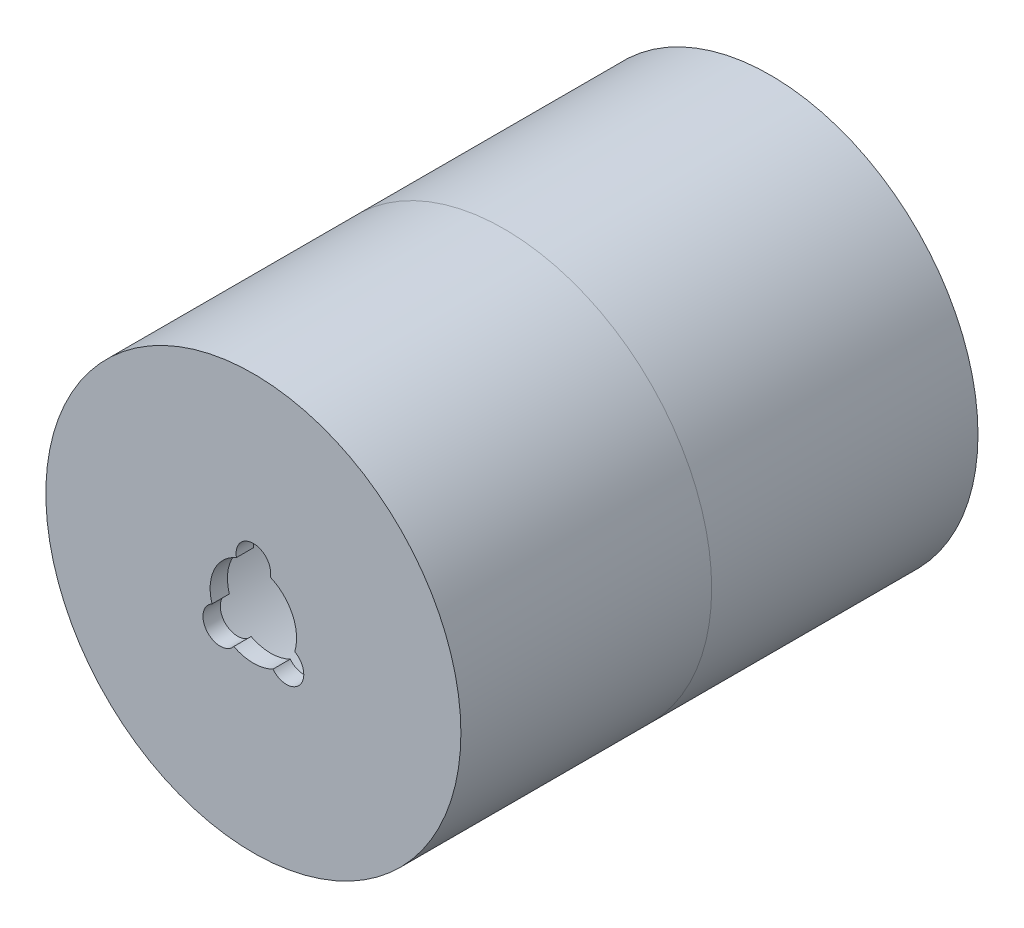
ISO-10303-21;
HEADER;
FILE_DESCRIPTION(('STEP AP214'),'2;1');
FILE_NAME('part.step','',(''),(''),'','','');
FILE_SCHEMA(('AUTOMOTIVE_DESIGN { 1 0 10303 214 1 1 1 1 }'));
ENDSEC;
DATA;
#1=APPLICATION_CONTEXT('core data for automotive mechanical design processes');
#2=APPLICATION_PROTOCOL_DEFINITION('international standard','automotive_design',2000,#1);
#3=PRODUCT_CONTEXT('',#1,'mechanical');
#4=PRODUCT('Part','Part','',(#3));
#5=PRODUCT_RELATED_PRODUCT_CATEGORY('part','',(#4));
#6=PRODUCT_DEFINITION_FORMATION('','',#4);
#7=PRODUCT_DEFINITION_CONTEXT('part definition',#1,'design');
#8=PRODUCT_DEFINITION('design','',#6,#7);
#9=PRODUCT_DEFINITION_SHAPE('','',#8);
#10=(LENGTH_UNIT() NAMED_UNIT(*) SI_UNIT(.MILLI.,.METRE.));
#11=(NAMED_UNIT(*) PLANE_ANGLE_UNIT() SI_UNIT($,.RADIAN.));
#12=(NAMED_UNIT(*) SI_UNIT($,.STERADIAN.) SOLID_ANGLE_UNIT());
#13=UNCERTAINTY_MEASURE_WITH_UNIT(LENGTH_MEASURE(1.E-05),#10,'distance_accuracy_value','');
#14=(GEOMETRIC_REPRESENTATION_CONTEXT(3) GLOBAL_UNCERTAINTY_ASSIGNED_CONTEXT((#13)) GLOBAL_UNIT_ASSIGNED_CONTEXT((#10,
#11,#12)) REPRESENTATION_CONTEXT('',''));
#15=CARTESIAN_POINT('',(0.,0.,0.));
#16=DIRECTION('',(0.,0.,1.));
#17=DIRECTION('',(1.,0.,0.));
#18=AXIS2_PLACEMENT_3D('',#15,#16,#17);
#19=CARTESIAN_POINT('',(0.,0.,30.8));
#20=DIRECTION('',(0.,0.,1.));
#21=DIRECTION('',(1.,0.,0.));
#22=AXIS2_PLACEMENT_3D('',#19,#20,#21);
#23=PLANE('',#22);
#24=CARTESIAN_POINT('',(0.,0.,30.8));
#25=DIRECTION('',(0.,0.,1.));
#26=DIRECTION('',(1.,0.,0.));
#27=AXIS2_PLACEMENT_3D('',#24,#25,#26);
#28=CIRCLE('',#27,22.2);
#29=CARTESIAN_POINT('',(22.2,0.,30.8));
#30=VERTEX_POINT('',#29);
#31=EDGE_CURVE('E229',#30,#30,#28,.F.);
#32=ORIENTED_EDGE('',*,*,#31,.T.);
#33=EDGE_LOOP('',(#32));
#34=FACE_BOUND('',#33,.T.);
#35=CARTESIAN_POINT('',(0.,0.,30.7999999999999));
#36=DIRECTION('',(0.,0.,1.));
#37=DIRECTION('',(1.,0.,0.));
#38=AXIS2_PLACEMENT_3D('',#35,#36,#37);
#39=CIRCLE('',#38,24.);
#40=CARTESIAN_POINT('',(24.,0.,30.7999999999999));
#41=VERTEX_POINT('',#40);
#42=EDGE_CURVE('E233',#41,#41,#39,.F.);
#43=ORIENTED_EDGE('',*,*,#42,.F.);
#44=EDGE_LOOP('',(#43));
#45=FACE_BOUND('',#44,.T.);
#46=ADVANCED_FACE('F93',(#34,#45),#23,.T.);
#47=CARTESIAN_POINT('',(0.,0.,1072.38147752167));
#48=DIRECTION('',(0.,0.,1.));
#49=DIRECTION('',(1.,0.,0.));
#50=AXIS2_PLACEMENT_3D('',#47,#48,#49);
#51=CYLINDRICAL_SURFACE('',#50,24.);
#52=CARTESIAN_POINT('',(0.,0.,0.));
#53=DIRECTION('',(0.,0.,1.));
#54=DIRECTION('',(1.,0.,0.));
#55=AXIS2_PLACEMENT_3D('',#52,#53,#54);
#56=CIRCLE('',#55,24.);
#57=CARTESIAN_POINT('',(24.,0.,0.));
#58=VERTEX_POINT('',#57);
#59=EDGE_CURVE('E237',#58,#58,#56,.T.);
#60=ORIENTED_EDGE('',*,*,#59,.T.);
#61=EDGE_LOOP('',(#60));
#62=FACE_BOUND('',#61,.T.);
#63=ORIENTED_EDGE('',*,*,#42,.T.);
#64=EDGE_LOOP('',(#63));
#65=FACE_BOUND('',#64,.T.);
#66=ADVANCED_FACE('F95',(#62,#65),#51,.T.);
#67=CARTESIAN_POINT('',(0.,0.,28.8));
#68=DIRECTION('',(0.,0.,1.));
#69=DIRECTION('',(1.,0.,0.));
#70=AXIS2_PLACEMENT_3D('',#67,#68,#69);
#71=CYLINDRICAL_SURFACE('',#70,22.2);
#72=CARTESIAN_POINT('',(0.,0.,29.8));
#73=DIRECTION('',(0.,0.,1.));
#74=DIRECTION('',(1.,0.,0.));
#75=AXIS2_PLACEMENT_3D('',#72,#73,#74);
#76=CIRCLE('',#75,22.2);
#77=CARTESIAN_POINT('',(-7.5928471818306,20.8611761814471,29.8));
#78=VERTEX_POINT('',#77);
#79=CARTESIAN_POINT('',(7.59284718183028,20.8611761814471,29.8));
#80=VERTEX_POINT('',#79);
#81=EDGE_CURVE('E103',#78,#80,#76,.T.);
#82=ORIENTED_EDGE('',*,*,#81,.F.);
#83=DIRECTION('',(0.,0.,1.));
#84=VECTOR('',#83,1.);
#85=CARTESIAN_POINT('',(-7.5928471818306,20.8611761814471,28.8));
#86=LINE('',#85,#84);
#87=CARTESIAN_POINT('',(-7.5928471818306,20.8611761814471,28.8));
#88=VERTEX_POINT('',#87);
#89=EDGE_CURVE('E216',#88,#78,#86,.T.);
#90=ORIENTED_EDGE('',*,*,#89,.F.);
#91=CARTESIAN_POINT('',(0.,0.,28.8));
#92=DIRECTION('',(0.,0.,1.));
#93=DIRECTION('',(1.,0.,0.));
#94=AXIS2_PLACEMENT_3D('',#91,#92,#93);
#95=CIRCLE('',#94,22.2);
#96=CARTESIAN_POINT('',(7.59284718183028,20.8611761814471,28.8));
#97=VERTEX_POINT('',#96);
#98=EDGE_CURVE('E338',#97,#88,#95,.T.);
#99=ORIENTED_EDGE('',*,*,#98,.F.);
#100=DIRECTION('',(0.,0.,1.));
#101=VECTOR('',#100,1.);
#102=CARTESIAN_POINT('',(7.59284718183028,20.8611761814471,28.8));
#103=LINE('',#102,#101);
#104=EDGE_CURVE('E213',#97,#80,#103,.T.);
#105=ORIENTED_EDGE('',*,*,#104,.T.);
#106=EDGE_LOOP('',(#82,#90,#99,#105));
#107=FACE_BOUND('',#106,.T.);
#108=ORIENTED_EDGE('',*,*,#31,.F.);
#109=EDGE_LOOP('',(#108));
#110=FACE_BOUND('',#109,.T.);
#111=ADVANCED_FACE('F273',(#107,#110),#71,.F.);
#112=CARTESIAN_POINT('',(0.,0.,1072.38147752167));
#113=DIRECTION('',(0.,0.,1.));
#114=DIRECTION('',(1.,0.,0.));
#115=AXIS2_PLACEMENT_3D('',#112,#113,#114);
#116=CYLINDRICAL_SURFACE('',#115,17.);
#117=CARTESIAN_POINT('',(0.,0.,1.80000000000002));
#118=DIRECTION('',(0.,0.,1.));
#119=DIRECTION('',(1.,0.,0.));
#120=AXIS2_PLACEMENT_3D('',#117,#118,#119);
#121=CIRCLE('',#120,17.);
#122=CARTESIAN_POINT('',(17.,0.,1.80000000000002));
#123=VERTEX_POINT('',#122);
#124=EDGE_CURVE('E328',#123,#123,#121,.T.);
#125=ORIENTED_EDGE('',*,*,#124,.F.);
#126=EDGE_LOOP('',(#125));
#127=FACE_BOUND('',#126,.T.);
#128=CARTESIAN_POINT('',(0.,0.,29.8));
#129=DIRECTION('',(0.,0.,1.));
#130=DIRECTION('',(1.,0.,0.));
#131=AXIS2_PLACEMENT_3D('',#128,#129,#130);
#132=CIRCLE('',#131,17.);
#133=CARTESIAN_POINT('',(-4.68397596917369,16.3419817990415,29.8));
#134=VERTEX_POINT('',#133);
#135=CARTESIAN_POINT('',(4.68397596917369,16.3419817990415,29.8));
#136=VERTEX_POINT('',#135);
#137=EDGE_CURVE('E245',#134,#136,#132,.F.);
#138=ORIENTED_EDGE('',*,*,#137,.F.);
#139=DIRECTION('',(0.,0.,1.));
#140=VECTOR('',#139,1.);
#141=CARTESIAN_POINT('',(-4.68397596917369,16.3419817990415,28.8));
#142=LINE('',#141,#140);
#143=CARTESIAN_POINT('',(-4.68397596917369,16.3419817990415,28.8));
#144=VERTEX_POINT('',#143);
#145=EDGE_CURVE('E205',#144,#134,#142,.T.);
#146=ORIENTED_EDGE('',*,*,#145,.F.);
#147=CARTESIAN_POINT('',(0.,0.,28.8));
#148=DIRECTION('',(0.,0.,1.));
#149=DIRECTION('',(1.,0.,0.));
#150=AXIS2_PLACEMENT_3D('',#147,#148,#149);
#151=CIRCLE('',#150,17.);
#152=CARTESIAN_POINT('',(4.68397596917369,16.3419817990415,28.8));
#153=VERTEX_POINT('',#152);
#154=EDGE_CURVE('E349',#144,#153,#151,.T.);
#155=ORIENTED_EDGE('',*,*,#154,.T.);
#156=DIRECTION('',(0.,0.,1.));
#157=VECTOR('',#156,1.);
#158=CARTESIAN_POINT('',(4.68397596917369,16.3419817990415,28.8));
#159=LINE('',#158,#157);
#160=EDGE_CURVE('E199',#153,#136,#159,.T.);
#161=ORIENTED_EDGE('',*,*,#160,.T.);
#162=EDGE_LOOP('',(#138,#146,#155,#161));
#163=FACE_BOUND('',#162,.T.);
#164=ADVANCED_FACE('F269',(#127,#163),#116,.F.);
#165=CARTESIAN_POINT('',(0.,0.,28.8));
#166=DIRECTION('',(0.939692620785902,-0.342020143325687,0.));
#167=DIRECTION('',(0.342020143325687,0.939692620785902,0.));
#168=AXIS2_PLACEMENT_3D('',#165,#166,#167);
#169=PLANE('',#168);
#170=DIRECTION('',(0.342020143325687,0.939692620785902,0.));
#171=VECTOR('',#170,1.);
#172=CARTESIAN_POINT('',(0.,0.,29.8));
#173=LINE('',#172,#171);
#174=CARTESIAN_POINT('',(6.56678675185322,18.0420983190894,29.8));
#175=VERTEX_POINT('',#174);
#176=EDGE_CURVE('E381',#175,#80,#173,.T.);
#177=ORIENTED_EDGE('',*,*,#176,.T.);
#178=ORIENTED_EDGE('',*,*,#104,.F.);
#179=DIRECTION('',(0.342020143325687,0.939692620785902,0.));
#180=VECTOR('',#179,1.);
#181=CARTESIAN_POINT('',(0.,0.,28.8));
#182=LINE('',#181,#180);
#183=CARTESIAN_POINT('',(6.56678675185322,18.0420983190894,28.8));
#184=VERTEX_POINT('',#183);
#185=EDGE_CURVE('E342',#184,#97,#182,.T.);
#186=ORIENTED_EDGE('',*,*,#185,.F.);
#187=DIRECTION('',(0.,0.,1.));
#188=VECTOR('',#187,1.);
#189=CARTESIAN_POINT('',(6.56678675185322,18.0420983190894,28.8));
#190=LINE('',#189,#188);
#191=EDGE_CURVE('E224',#184,#175,#190,.T.);
#192=ORIENTED_EDGE('',*,*,#191,.T.);
#193=EDGE_LOOP('',(#177,#178,#186,#192));
#194=FACE_BOUND('',#193,.T.);
#195=ADVANCED_FACE('F265',(#194),#169,.F.);
#196=CARTESIAN_POINT('',(0.,0.,28.8));
#197=DIRECTION('',(0.,0.,1.));
#198=DIRECTION('',(1.,0.,0.));
#199=AXIS2_PLACEMENT_3D('',#196,#197,#198);
#200=CYLINDRICAL_SURFACE('',#199,19.2);
#201=DIRECTION('',(0.,0.,1.));
#202=VECTOR('',#201,1.);
#203=CARTESIAN_POINT('',(-6.56678675185351,18.0420983190894,28.8));
#204=LINE('',#203,#202);
#205=CARTESIAN_POINT('',(-6.56678675185351,18.0420983190894,28.8));
#206=VERTEX_POINT('',#205);
#207=CARTESIAN_POINT('',(-6.56678675185351,18.0420983190894,29.8));
#208=VERTEX_POINT('',#207);
#209=EDGE_CURVE('E220',#206,#208,#204,.T.);
#210=ORIENTED_EDGE('',*,*,#209,.T.);
#211=CARTESIAN_POINT('',(0.,0.,29.8));
#212=DIRECTION('',(0.,0.,1.));
#213=DIRECTION('',(1.,0.,0.));
#214=AXIS2_PLACEMENT_3D('',#211,#212,#213);
#215=CIRCLE('',#214,19.2);
#216=EDGE_CURVE('E378',#175,#208,#215,.F.);
#217=ORIENTED_EDGE('',*,*,#216,.F.);
#218=ORIENTED_EDGE('',*,*,#191,.F.);
#219=CARTESIAN_POINT('',(0.,0.,28.8));
#220=DIRECTION('',(0.,0.,1.));
#221=DIRECTION('',(1.,0.,0.));
#222=AXIS2_PLACEMENT_3D('',#219,#220,#221);
#223=CIRCLE('',#222,19.2);
#224=EDGE_CURVE('E198',#184,#206,#223,.F.);
#225=ORIENTED_EDGE('',*,*,#224,.T.);
#226=EDGE_LOOP('',(#210,#217,#218,#225));
#227=FACE_BOUND('',#226,.T.);
#228=ADVANCED_FACE('F262',(#227),#200,.F.);
#229=CARTESIAN_POINT('',(0.,0.,28.8));
#230=DIRECTION('',(0.939692620785897,0.342020143325699,0.));
#231=DIRECTION('',(-0.342020143325699,0.939692620785897,0.));
#232=AXIS2_PLACEMENT_3D('',#229,#230,#231);
#233=PLANE('',#232);
#234=ORIENTED_EDGE('',*,*,#89,.T.);
#235=DIRECTION('',(-0.342020143325699,0.939692620785897,0.));
#236=VECTOR('',#235,1.);
#237=CARTESIAN_POINT('',(0.,0.,29.8));
#238=LINE('',#237,#236);
#239=EDGE_CURVE('E13',#208,#78,#238,.T.);
#240=ORIENTED_EDGE('',*,*,#239,.F.);
#241=ORIENTED_EDGE('',*,*,#209,.F.);
#242=DIRECTION('',(-0.342020143325699,0.939692620785897,0.));
#243=VECTOR('',#242,1.);
#244=CARTESIAN_POINT('',(0.,0.,28.8));
#245=LINE('',#244,#243);
#246=EDGE_CURVE('E335',#206,#88,#245,.T.);
#247=ORIENTED_EDGE('',*,*,#246,.T.);
#248=EDGE_LOOP('',(#234,#240,#241,#247));
#249=FACE_BOUND('',#248,.T.);
#250=ADVANCED_FACE('F259',(#249),#233,.T.);
#251=CARTESIAN_POINT('',(-1.,19.9722249756745,28.8));
#252=CARTESIAN_POINT('',(-1.83751743884076,19.9722249756745,28.8));
#253=CARTESIAN_POINT('',(-3.40068888477795,17.6065514435698,28.8));
#254=CARTESIAN_POINT('',(-4.50526886810057,16.5180823598799,28.8));
#255=B_SPLINE_CURVE_WITH_KNOTS('',3,(#251,#252,#253,#254),.UNSPECIFIED.,.F.,.F.,(4,4),(0.,1.),.UNSPECIFIED.);
#256=DIRECTION('',(0.,0.,1.));
#257=VECTOR('',#256,1.);
#258=SURFACE_OF_LINEAR_EXTRUSION('',#255,#257);
#259=DIRECTION('',(0.,0.,1.));
#260=VECTOR('',#259,1.);
#261=CARTESIAN_POINT('',(-4.50526886810057,16.5180823598799,28.8));
#262=LINE('',#261,#260);
#263=CARTESIAN_POINT('',(-4.50526886810057,16.5180823598799,28.8));
#264=VERTEX_POINT('',#263);
#265=CARTESIAN_POINT('',(-4.50526886810057,16.5180823598799,29.8));
#266=VERTEX_POINT('',#265);
#267=EDGE_CURVE('E209',#264,#266,#262,.T.);
#268=ORIENTED_EDGE('',*,*,#267,.T.);
#269=CARTESIAN_POINT('',(-1.,19.9722249756745,29.8));
#270=CARTESIAN_POINT('',(-1.83751743884076,19.9722249756745,29.8));
#271=CARTESIAN_POINT('',(-3.40068888477795,17.6065514435698,29.8));
#272=CARTESIAN_POINT('',(-4.50526886810057,16.5180823598799,29.8));
#273=B_SPLINE_CURVE_WITH_KNOTS('',3,(#269,#270,#271,#272),.UNSPECIFIED.,.F.,.F.,(4,4),(0.,1.),.UNSPECIFIED.);
#274=CARTESIAN_POINT('',(-1.,19.9722249756745,29.8));
#275=VERTEX_POINT('',#274);
#276=EDGE_CURVE('E188',#275,#266,#273,.T.);
#277=ORIENTED_EDGE('',*,*,#276,.F.);
#278=DIRECTION('',(0.,0.,1.));
#279=VECTOR('',#278,1.);
#280=CARTESIAN_POINT('',(-1.,19.9722249756745,28.8));
#281=LINE('',#280,#279);
#282=CARTESIAN_POINT('',(-1.,19.9722249756745,28.8));
#283=VERTEX_POINT('',#282);
#284=EDGE_CURVE('E97',#283,#275,#281,.T.);
#285=ORIENTED_EDGE('',*,*,#284,.F.);
#286=EDGE_CURVE('E238',#283,#264,#255,.T.);
#287=ORIENTED_EDGE('',*,*,#286,.T.);
#288=EDGE_LOOP('',(#268,#277,#285,#287));
#289=FACE_BOUND('',#288,.T.);
#290=ADVANCED_FACE('F254',(#289),#258,.T.);
#291=CARTESIAN_POINT('',(-10.4776887180417,10.6327735007392,28.8));
#292=DIRECTION('',(-0.701893189425482,0.712282212776737,0.));
#293=DIRECTION('',(-0.712282212776737,-0.701893189425482,0.));
#294=AXIS2_PLACEMENT_3D('',#291,#292,#293);
#295=PLANE('',#294);
#296=ORIENTED_EDGE('',*,*,#145,.T.);
#297=DIRECTION('',(-0.712282212776737,-0.701893189425482,0.));
#298=VECTOR('',#297,1.);
#299=CARTESIAN_POINT('',(-10.4776887180417,10.6327735007392,29.8));
#300=LINE('',#299,#298);
#301=EDGE_CURVE('E361',#266,#134,#300,.T.);
#302=ORIENTED_EDGE('',*,*,#301,.F.);
#303=ORIENTED_EDGE('',*,*,#267,.F.);
#304=DIRECTION('',(-0.712282212776737,-0.701893189425482,0.));
#305=VECTOR('',#304,1.);
#306=CARTESIAN_POINT('',(-10.4776887180417,10.6327735007392,28.8));
#307=LINE('',#306,#305);
#308=EDGE_CURVE('E346',#264,#144,#307,.T.);
#309=ORIENTED_EDGE('',*,*,#308,.T.);
#310=EDGE_LOOP('',(#296,#302,#303,#309));
#311=FACE_BOUND('',#310,.T.);
#312=ADVANCED_FACE('F258',(#311),#295,.T.);
#313=CARTESIAN_POINT('',(10.4776887180417,10.6327735007392,28.8));
#314=DIRECTION('',(-0.701893189425482,-0.712282212776737,0.));
#315=DIRECTION('',(0.712282212776737,-0.701893189425482,0.));
#316=AXIS2_PLACEMENT_3D('',#313,#314,#315);
#317=PLANE('',#316);
#318=DIRECTION('',(0.712282212776737,-0.701893189425482,0.));
#319=VECTOR('',#318,1.);
#320=CARTESIAN_POINT('',(10.4776887180417,10.6327735007392,29.8));
#321=LINE('',#320,#319);
#322=CARTESIAN_POINT('',(4.50526886810057,16.5180823598799,29.8));
#323=VERTEX_POINT('',#322);
#324=EDGE_CURVE('E175',#323,#136,#321,.T.);
#325=ORIENTED_EDGE('',*,*,#324,.T.);
#326=ORIENTED_EDGE('',*,*,#160,.F.);
#327=DIRECTION('',(0.712282212776737,-0.701893189425482,0.));
#328=VECTOR('',#327,1.);
#329=CARTESIAN_POINT('',(10.4776887180417,10.6327735007392,28.8));
#330=LINE('',#329,#328);
#331=CARTESIAN_POINT('',(4.50526886810057,16.5180823598799,28.8));
#332=VERTEX_POINT('',#331);
#333=EDGE_CURVE('E353',#332,#153,#330,.T.);
#334=ORIENTED_EDGE('',*,*,#333,.F.);
#335=DIRECTION('',(0.,0.,1.));
#336=VECTOR('',#335,1.);
#337=CARTESIAN_POINT('',(4.50526886810057,16.5180823598799,28.8));
#338=LINE('',#337,#336);
#339=EDGE_CURVE('E195',#332,#323,#338,.T.);
#340=ORIENTED_EDGE('',*,*,#339,.T.);
#341=EDGE_LOOP('',(#325,#326,#334,#340));
#342=FACE_BOUND('',#341,.T.);
#343=ADVANCED_FACE('F397',(#342),#317,.F.);
#344=CARTESIAN_POINT('',(1.,19.9722249756745,28.8));
#345=CARTESIAN_POINT('',(1.83751743884076,19.9722249756745,28.8));
#346=CARTESIAN_POINT('',(3.40068888477795,17.6065514435698,28.8));
#347=CARTESIAN_POINT('',(4.50526886810057,16.5180823598799,28.8));
#348=B_SPLINE_CURVE_WITH_KNOTS('',3,(#344,#345,#346,#347),.UNSPECIFIED.,.F.,.F.,(4,4),(0.,1.),.UNSPECIFIED.);
#349=DIRECTION('',(0.,0.,1.));
#350=VECTOR('',#349,1.);
#351=SURFACE_OF_LINEAR_EXTRUSION('',#348,#350);
#352=CARTESIAN_POINT('',(1.,19.9722249756745,29.8));
#353=CARTESIAN_POINT('',(1.83751743884076,19.9722249756745,29.8));
#354=CARTESIAN_POINT('',(3.40068888477795,17.6065514435698,29.8));
#355=CARTESIAN_POINT('',(4.50526886810057,16.5180823598799,29.8));
#356=B_SPLINE_CURVE_WITH_KNOTS('',3,(#352,#353,#354,#355),.UNSPECIFIED.,.F.,.F.,(4,4),(0.,1.),.UNSPECIFIED.);
#357=CARTESIAN_POINT('',(1.,19.9722249756745,29.8));
#358=VERTEX_POINT('',#357);
#359=EDGE_CURVE('E169',#358,#323,#356,.T.);
#360=ORIENTED_EDGE('',*,*,#359,.T.);
#361=ORIENTED_EDGE('',*,*,#339,.F.);
#362=CARTESIAN_POINT('',(1.,19.9722249756745,28.8));
#363=VERTEX_POINT('',#362);
#364=EDGE_CURVE('E192',#363,#332,#348,.T.);
#365=ORIENTED_EDGE('',*,*,#364,.F.);
#366=DIRECTION('',(0.,0.,1.));
#367=VECTOR('',#366,1.);
#368=CARTESIAN_POINT('',(1.,19.9722249756745,28.8));
#369=LINE('',#368,#367);
#370=EDGE_CURVE('E185',#363,#358,#369,.T.);
#371=ORIENTED_EDGE('',*,*,#370,.T.);
#372=EDGE_LOOP('',(#360,#361,#365,#371));
#373=FACE_BOUND('',#372,.T.);
#374=ADVANCED_FACE('F190',(#373),#351,.F.);
#375=CARTESIAN_POINT('',(0.,19.9722249756745,28.8));
#376=DIRECTION('',(0.,-1.,0.));
#377=DIRECTION('',(0.,0.,-1.));
#378=AXIS2_PLACEMENT_3D('',#375,#376,#377);
#379=PLANE('',#378);
#380=DIRECTION('',(1.,0.,0.));
#381=VECTOR('',#380,1.);
#382=CARTESIAN_POINT('',(0.,19.9722249756745,29.8));
#383=LINE('',#382,#381);
#384=EDGE_CURVE('E172',#275,#358,#383,.T.);
#385=ORIENTED_EDGE('',*,*,#384,.T.);
#386=ORIENTED_EDGE('',*,*,#370,.F.);
#387=DIRECTION('',(1.,0.,0.));
#388=VECTOR('',#387,1.);
#389=CARTESIAN_POINT('',(0.,19.9722249756745,28.8));
#390=LINE('',#389,#388);
#391=EDGE_CURVE('E246',#283,#363,#390,.T.);
#392=ORIENTED_EDGE('',*,*,#391,.F.);
#393=ORIENTED_EDGE('',*,*,#284,.T.);
#394=EDGE_LOOP('',(#385,#386,#392,#393));
#395=FACE_BOUND('',#394,.T.);
#396=ADVANCED_FACE('F183',(#395),#379,.F.);
#397=CARTESIAN_POINT('',(0.,0.,0.));
#398=DIRECTION('',(0.,0.,1.));
#399=DIRECTION('',(1.,0.,0.));
#400=AXIS2_PLACEMENT_3D('',#397,#398,#399);
#401=PLANE('',#400);
#402=ORIENTED_EDGE('',*,*,#59,.F.);
#403=EDGE_LOOP('',(#402));
#404=FACE_BOUND('',#403,.T.);
#405=CARTESIAN_POINT('',(0.,0.,0.));
#406=DIRECTION('',(0.,0.,1.));
#407=DIRECTION('',(1.,0.,0.));
#408=AXIS2_PLACEMENT_3D('',#405,#406,#407);
#409=CIRCLE('',#408,13.);
#410=CARTESIAN_POINT('',(13.,0.,0.));
#411=VERTEX_POINT('',#410);
#412=EDGE_CURVE('E228',#411,#411,#409,.T.);
#413=ORIENTED_EDGE('',*,*,#412,.T.);
#414=EDGE_LOOP('',(#413));
#415=FACE_BOUND('',#414,.T.);
#416=ADVANCED_FACE('F311',(#404,#415),#401,.F.);
#417=CARTESIAN_POINT('',(0.,0.,1.8));
#418=DIRECTION('',(0.,0.,1.));
#419=DIRECTION('',(1.,0.,0.));
#420=AXIS2_PLACEMENT_3D('',#417,#418,#419);
#421=PLANE('',#420);
#422=ORIENTED_EDGE('',*,*,#124,.T.);
#423=EDGE_LOOP('',(#422));
#424=FACE_BOUND('',#423,.T.);
#425=CARTESIAN_POINT('',(0.,0.,1.80000000000002));
#426=DIRECTION('',(0.,0.,1.));
#427=DIRECTION('',(1.,0.,0.));
#428=AXIS2_PLACEMENT_3D('',#425,#426,#427);
#429=CIRCLE('',#428,13.);
#430=CARTESIAN_POINT('',(13.,0.,1.80000000000002));
#431=VERTEX_POINT('',#430);
#432=EDGE_CURVE('E324',#431,#431,#429,.T.);
#433=ORIENTED_EDGE('',*,*,#432,.F.);
#434=EDGE_LOOP('',(#433));
#435=FACE_BOUND('',#434,.T.);
#436=ADVANCED_FACE('F307',(#424,#435),#421,.T.);
#437=CARTESIAN_POINT('',(0.,0.,1072.38147752167));
#438=DIRECTION('',(0.,0.,1.));
#439=DIRECTION('',(1.,0.,0.));
#440=AXIS2_PLACEMENT_3D('',#437,#438,#439);
#441=CYLINDRICAL_SURFACE('',#440,13.);
#442=ORIENTED_EDGE('',*,*,#412,.F.);
#443=EDGE_LOOP('',(#442));
#444=FACE_BOUND('',#443,.T.);
#445=ORIENTED_EDGE('',*,*,#432,.T.);
#446=EDGE_LOOP('',(#445));
#447=FACE_BOUND('',#446,.T.);
#448=ADVANCED_FACE('F303',(#444,#447),#441,.F.);
#449=CARTESIAN_POINT('',(0.,0.,28.8));
#450=DIRECTION('',(0.,0.,1.));
#451=DIRECTION('',(1.,0.,0.));
#452=AXIS2_PLACEMENT_3D('',#449,#450,#451);
#453=PLANE('',#452);
#454=ORIENTED_EDGE('',*,*,#286,.F.);
#455=ORIENTED_EDGE('',*,*,#391,.T.);
#456=ORIENTED_EDGE('',*,*,#364,.T.);
#457=ORIENTED_EDGE('',*,*,#333,.T.);
#458=ORIENTED_EDGE('',*,*,#154,.F.);
#459=ORIENTED_EDGE('',*,*,#308,.F.);
#460=EDGE_LOOP('',(#454,#455,#456,#457,#458,#459));
#461=FACE_BOUND('',#460,.T.);
#462=ORIENTED_EDGE('',*,*,#185,.T.);
#463=ORIENTED_EDGE('',*,*,#98,.T.);
#464=ORIENTED_EDGE('',*,*,#246,.F.);
#465=ORIENTED_EDGE('',*,*,#224,.F.);
#466=EDGE_LOOP('',(#462,#463,#464,#465));
#467=FACE_BOUND('',#466,.T.);
#468=ADVANCED_FACE('F299',(#461,#467),#453,.T.);
#469=CARTESIAN_POINT('',(0.,0.,29.8));
#470=DIRECTION('',(0.,0.,1.));
#471=DIRECTION('',(1.,0.,0.));
#472=AXIS2_PLACEMENT_3D('',#469,#470,#471);
#473=PLANE('',#472);
#474=ORIENTED_EDGE('',*,*,#239,.T.);
#475=ORIENTED_EDGE('',*,*,#81,.T.);
#476=ORIENTED_EDGE('',*,*,#176,.F.);
#477=ORIENTED_EDGE('',*,*,#216,.T.);
#478=EDGE_LOOP('',(#474,#475,#476,#477));
#479=FACE_BOUND('',#478,.T.);
#480=ADVANCED_FACE('F294',(#479),#473,.T.);
#481=CARTESIAN_POINT('',(0.,0.,29.8));
#482=DIRECTION('',(0.,0.,1.));
#483=DIRECTION('',(1.,0.,0.));
#484=AXIS2_PLACEMENT_3D('',#481,#482,#483);
#485=PLANE('',#484);
#486=ORIENTED_EDGE('',*,*,#137,.T.);
#487=ORIENTED_EDGE('',*,*,#324,.F.);
#488=ORIENTED_EDGE('',*,*,#359,.F.);
#489=ORIENTED_EDGE('',*,*,#384,.F.);
#490=ORIENTED_EDGE('',*,*,#276,.T.);
#491=ORIENTED_EDGE('',*,*,#301,.T.);
#492=EDGE_LOOP('',(#486,#487,#488,#489,#490,#491));
#493=FACE_BOUND('',#492,.T.);
#494=ADVANCED_FACE('F171',(#493),#485,.T.);
#495=CLOSED_SHELL('',(#46,#66,#111,#164,#195,#228,#250,#290,#312,#343,#374,#396,#416,#436,#448,
#468,#480,#494));
#496=MANIFOLD_SOLID_BREP('B2',#495);
#497=CARTESIAN_POINT('',(0.,0.,30.8));
#498=DIRECTION('',(0.,0.,1.));
#499=DIRECTION('',(1.,0.,0.));
#500=AXIS2_PLACEMENT_3D('',#497,#498,#499);
#501=PLANE('',#500);
#502=CARTESIAN_POINT('',(0.,0.,30.7999999999999));
#503=DIRECTION('',(0.,0.,1.));
#504=DIRECTION('',(1.,0.,0.));
#505=AXIS2_PLACEMENT_3D('',#502,#503,#504);
#506=CIRCLE('',#505,24.);
#507=CARTESIAN_POINT('',(24.,0.,30.7999999999999));
#508=VERTEX_POINT('',#507);
#509=EDGE_CURVE('E91',#508,#508,#506,.F.);
#510=ORIENTED_EDGE('',*,*,#509,.T.);
#511=EDGE_LOOP('',(#510));
#512=FACE_BOUND('',#511,.T.);
#513=CARTESIAN_POINT('',(0.,0.,30.8));
#514=DIRECTION('',(0.,0.,1.));
#515=DIRECTION('',(1.,0.,0.));
#516=AXIS2_PLACEMENT_3D('',#513,#514,#515);
#517=CIRCLE('',#516,22.2);
#518=CARTESIAN_POINT('',(22.2,0.,30.8));
#519=VERTEX_POINT('',#518);
#520=EDGE_CURVE('E551',#519,#519,#517,.F.);
#521=ORIENTED_EDGE('',*,*,#520,.F.);
#522=EDGE_LOOP('',(#521));
#523=FACE_BOUND('',#522,.T.);
#524=ADVANCED_FACE('F544',(#512,#523),#501,.F.);
#525=CARTESIAN_POINT('',(0.,0.,57.8));
#526=DIRECTION('',(0.,0.,1.));
#527=DIRECTION('',(1.,0.,0.));
#528=AXIS2_PLACEMENT_3D('',#525,#526,#527);
#529=PLANE('',#528);
#530=CARTESIAN_POINT('',(0.,0.,57.8000000000001));
#531=DIRECTION('',(0.,0.,1.));
#532=DIRECTION('',(1.,0.,0.));
#533=AXIS2_PLACEMENT_3D('',#530,#531,#532);
#534=CIRCLE('',#533,17.);
#535=CARTESIAN_POINT('',(17.,0.,57.8000000000001));
#536=VERTEX_POINT('',#535);
#537=EDGE_CURVE('E686',#536,#536,#534,.T.);
#538=ORIENTED_EDGE('',*,*,#537,.F.);
#539=EDGE_LOOP('',(#538));
#540=FACE_BOUND('',#539,.T.);
#541=CARTESIAN_POINT('',(0.,0.,57.8000000000001));
#542=DIRECTION('',(0.,0.,1.));
#543=DIRECTION('',(1.,0.,0.));
#544=AXIS2_PLACEMENT_3D('',#541,#542,#543);
#545=CIRCLE('',#544,5.);
#546=CARTESIAN_POINT('',(-1.95959179422654,4.6,57.8));
#547=VERTEX_POINT('',#546);
#548=CARTESIAN_POINT('',(-4.78340576371954,-1.45568859980928,57.8));
#549=VERTEX_POINT('',#548);
#550=EDGE_CURVE('E669',#547,#549,#545,.T.);
#551=ORIENTED_EDGE('',*,*,#550,.T.);
#552=CARTESIAN_POINT('',(-3.8302222155949,-3.21393804843269,57.8));
#553=DIRECTION('',(0.,0.,1.));
#554=DIRECTION('',(1.,0.,0.));
#555=AXIS2_PLACEMENT_3D('',#552,#553,#554);
#556=CIRCLE('',#555,2.);
#557=CARTESIAN_POINT('',(-2.26420311297507,-4.45795740930687,57.8));
#558=VERTEX_POINT('',#557);
#559=EDGE_CURVE('E653',#558,#549,#556,.F.);
#560=ORIENTED_EDGE('',*,*,#559,.F.);
#561=CARTESIAN_POINT('',(2.26420311297507,-4.45795740930687,57.8));
#562=VERTEX_POINT('',#561);
#563=EDGE_CURVE('E679',#558,#562,#545,.T.);
#564=ORIENTED_EDGE('',*,*,#563,.T.);
#565=CARTESIAN_POINT('',(3.8302222155949,-3.21393804843269,57.8));
#566=DIRECTION('',(0.,0.,1.));
#567=DIRECTION('',(1.,0.,0.));
#568=AXIS2_PLACEMENT_3D('',#565,#566,#567);
#569=CIRCLE('',#568,2.);
#570=CARTESIAN_POINT('',(4.78340576371954,-1.45568859980928,57.8));
#571=VERTEX_POINT('',#570);
#572=EDGE_CURVE('E833',#571,#562,#569,.F.);
#573=ORIENTED_EDGE('',*,*,#572,.F.);
#574=CARTESIAN_POINT('',(1.95959179422654,4.6,57.8));
#575=VERTEX_POINT('',#574);
#576=EDGE_CURVE('E681',#571,#575,#545,.T.);
#577=ORIENTED_EDGE('',*,*,#576,.T.);
#578=CARTESIAN_POINT('',(0.,5.,57.8));
#579=DIRECTION('',(0.,0.,1.));
#580=DIRECTION('',(1.,0.,0.));
#581=AXIS2_PLACEMENT_3D('',#578,#579,#580);
#582=CIRCLE('',#581,2.);
#583=EDGE_CURVE('E677',#547,#575,#582,.F.);
#584=ORIENTED_EDGE('',*,*,#583,.F.);
#585=EDGE_LOOP('',(#551,#560,#564,#573,#577,#584));
#586=FACE_BOUND('',#585,.T.);
#587=ADVANCED_FACE('F675',(#540,#586),#529,.F.);
#588=CARTESIAN_POINT('',(0.,0.,31.8));
#589=DIRECTION('',(0.,0.,1.));
#590=DIRECTION('',(1.,0.,0.));
#591=AXIS2_PLACEMENT_3D('',#588,#589,#590);
#592=PLANE('',#591);
#593=DIRECTION('',(-0.712282212776737,-0.701893189425482,0.));
#594=VECTOR('',#593,1.);
#595=CARTESIAN_POINT('',(-10.4776887180417,10.6327735007392,31.8));
#596=LINE('',#595,#594);
#597=CARTESIAN_POINT('',(-4.50526886810057,16.5180823598799,31.8));
#598=VERTEX_POINT('',#597);
#599=CARTESIAN_POINT('',(-4.68397596917369,16.3419817990415,31.8));
#600=VERTEX_POINT('',#599);
#601=EDGE_CURVE('E863',#598,#600,#596,.T.);
#602=ORIENTED_EDGE('',*,*,#601,.F.);
#603=CARTESIAN_POINT('',(-1.,19.9722249756745,31.8));
#604=CARTESIAN_POINT('',(-1.83751743884076,19.9722249756745,31.8));
#605=CARTESIAN_POINT('',(-3.40068888477795,17.6065514435698,31.8));
#606=CARTESIAN_POINT('',(-4.50526886810057,16.5180823598799,31.8));
#607=B_SPLINE_CURVE_WITH_KNOTS('',3,(#603,#604,#605,#606),.UNSPECIFIED.,.F.,.F.,(4,4),(0.,1.),.UNSPECIFIED.);
#608=CARTESIAN_POINT('',(-1.,19.9722249756745,31.8));
#609=VERTEX_POINT('',#608);
#610=EDGE_CURVE('E858',#609,#598,#607,.T.);
#611=ORIENTED_EDGE('',*,*,#610,.F.);
#612=DIRECTION('',(1.,0.,0.));
#613=VECTOR('',#612,1.);
#614=CARTESIAN_POINT('',(0.,19.9722249756745,31.8));
#615=LINE('',#614,#613);
#616=CARTESIAN_POINT('',(1.,19.9722249756745,31.8));
#617=VERTEX_POINT('',#616);
#618=EDGE_CURVE('E853',#609,#617,#615,.T.);
#619=ORIENTED_EDGE('',*,*,#618,.T.);
#620=CARTESIAN_POINT('',(1.,19.9722249756745,31.8));
#621=CARTESIAN_POINT('',(1.83751743884076,19.9722249756745,31.8));
#622=CARTESIAN_POINT('',(3.40068888477795,17.6065514435698,31.8));
#623=CARTESIAN_POINT('',(4.50526886810057,16.5180823598799,31.8));
#624=B_SPLINE_CURVE_WITH_KNOTS('',3,(#620,#621,#622,#623),.UNSPECIFIED.,.F.,.F.,(4,4),(0.,1.),.UNSPECIFIED.);
#625=CARTESIAN_POINT('',(4.50526886810057,16.5180823598799,31.8));
#626=VERTEX_POINT('',#625);
#627=EDGE_CURVE('E849',#617,#626,#624,.T.);
#628=ORIENTED_EDGE('',*,*,#627,.T.);
#629=DIRECTION('',(0.712282212776737,-0.701893189425482,0.));
#630=VECTOR('',#629,1.);
#631=CARTESIAN_POINT('',(10.4776887180417,10.6327735007392,31.8));
#632=LINE('',#631,#630);
#633=CARTESIAN_POINT('',(4.68397596917369,16.3419817990415,31.8));
#634=VERTEX_POINT('',#633);
#635=EDGE_CURVE('E847',#626,#634,#632,.T.);
#636=ORIENTED_EDGE('',*,*,#635,.T.);
#637=CARTESIAN_POINT('',(0.,0.,31.8000000000001));
#638=DIRECTION('',(0.,0.,1.));
#639=DIRECTION('',(1.,0.,0.));
#640=AXIS2_PLACEMENT_3D('',#637,#638,#639);
#641=CIRCLE('',#640,17.);
#642=EDGE_CURVE('E749',#600,#634,#641,.F.);
#643=ORIENTED_EDGE('',*,*,#642,.F.);
#644=EDGE_LOOP('',(#602,#611,#619,#628,#636,#643));
#645=FACE_BOUND('',#644,.T.);
#646=ADVANCED_FACE('F775',(#645),#592,.F.);
#647=CARTESIAN_POINT('',(0.,19.9722249756745,28.8));
#648=DIRECTION('',(0.,-1.,0.));
#649=DIRECTION('',(0.,0.,-1.));
#650=AXIS2_PLACEMENT_3D('',#647,#648,#649);
#651=PLANE('',#650);
#652=DIRECTION('',(0.,0.,1.));
#653=VECTOR('',#652,1.);
#654=CARTESIAN_POINT('',(1.,19.9722249756745,28.8));
#655=LINE('',#654,#653);
#656=CARTESIAN_POINT('',(1.,19.9722249756745,32.8));
#657=VERTEX_POINT('',#656);
#658=EDGE_CURVE('E697',#617,#657,#655,.T.);
#659=ORIENTED_EDGE('',*,*,#658,.F.);
#660=ORIENTED_EDGE('',*,*,#618,.F.);
#661=DIRECTION('',(0.,0.,1.));
#662=VECTOR('',#661,1.);
#663=CARTESIAN_POINT('',(-1.,19.9722249756745,28.8));
#664=LINE('',#663,#662);
#665=CARTESIAN_POINT('',(-1.,19.9722249756745,32.8));
#666=VERTEX_POINT('',#665);
#667=EDGE_CURVE('E695',#609,#666,#664,.T.);
#668=ORIENTED_EDGE('',*,*,#667,.T.);
#669=DIRECTION('',(1.,0.,0.));
#670=VECTOR('',#669,1.);
#671=CARTESIAN_POINT('',(0.,19.9722249756745,32.8));
#672=LINE('',#671,#670);
#673=EDGE_CURVE('E738',#666,#657,#672,.T.);
#674=ORIENTED_EDGE('',*,*,#673,.T.);
#675=EDGE_LOOP('',(#659,#660,#668,#674));
#676=FACE_BOUND('',#675,.T.);
#677=ADVANCED_FACE('F770',(#676),#651,.F.);
#678=CARTESIAN_POINT('',(1.,19.9722249756745,28.8));
#679=CARTESIAN_POINT('',(1.83751743884076,19.9722249756745,28.8));
#680=CARTESIAN_POINT('',(3.40068888477795,17.6065514435698,28.8));
#681=CARTESIAN_POINT('',(4.50526886810057,16.5180823598799,28.8));
#682=B_SPLINE_CURVE_WITH_KNOTS('',3,(#678,#679,#680,#681),.UNSPECIFIED.,.F.,.F.,(4,4),(0.,1.),.UNSPECIFIED.);
#683=DIRECTION('',(0.,0.,1.));
#684=VECTOR('',#683,1.);
#685=SURFACE_OF_LINEAR_EXTRUSION('',#682,#684);
#686=DIRECTION('',(0.,0.,1.));
#687=VECTOR('',#686,1.);
#688=CARTESIAN_POINT('',(4.50526886810057,16.5180823598799,28.8));
#689=LINE('',#688,#687);
#690=CARTESIAN_POINT('',(4.50526886810057,16.5180823598799,32.8));
#691=VERTEX_POINT('',#690);
#692=EDGE_CURVE('E700',#626,#691,#689,.T.);
#693=ORIENTED_EDGE('',*,*,#692,.F.);
#694=ORIENTED_EDGE('',*,*,#627,.F.);
#695=ORIENTED_EDGE('',*,*,#658,.T.);
#696=CARTESIAN_POINT('',(1.,19.9722249756745,32.8));
#697=CARTESIAN_POINT('',(1.83751743884076,19.9722249756745,32.8));
#698=CARTESIAN_POINT('',(3.40068888477795,17.6065514435698,32.8));
#699=CARTESIAN_POINT('',(4.50526886810057,16.5180823598799,32.8));
#700=B_SPLINE_CURVE_WITH_KNOTS('',3,(#696,#697,#698,#699),.UNSPECIFIED.,.F.,.F.,(4,4),(0.,1.),.UNSPECIFIED.);
#701=EDGE_CURVE('E733',#657,#691,#700,.T.);
#702=ORIENTED_EDGE('',*,*,#701,.T.);
#703=EDGE_LOOP('',(#693,#694,#695,#702));
#704=FACE_BOUND('',#703,.T.);
#705=ADVANCED_FACE('F765',(#704),#685,.F.);
#706=CARTESIAN_POINT('',(10.4776887180417,10.6327735007392,28.8));
#707=DIRECTION('',(-0.701893189425482,-0.712282212776737,0.));
#708=DIRECTION('',(0.712282212776737,-0.701893189425482,0.));
#709=AXIS2_PLACEMENT_3D('',#706,#707,#708);
#710=PLANE('',#709);
#711=DIRECTION('',(0.,0.,1.));
#712=VECTOR('',#711,1.);
#713=CARTESIAN_POINT('',(4.68397596917369,16.3419817990415,28.8));
#714=LINE('',#713,#712);
#715=CARTESIAN_POINT('',(4.68397596917369,16.3419817990415,32.8));
#716=VERTEX_POINT('',#715);
#717=EDGE_CURVE('E702',#634,#716,#714,.T.);
#718=ORIENTED_EDGE('',*,*,#717,.F.);
#719=ORIENTED_EDGE('',*,*,#635,.F.);
#720=ORIENTED_EDGE('',*,*,#692,.T.);
#721=DIRECTION('',(0.712282212776737,-0.701893189425482,0.));
#722=VECTOR('',#721,1.);
#723=CARTESIAN_POINT('',(10.4776887180417,10.6327735007392,32.8));
#724=LINE('',#723,#722);
#725=EDGE_CURVE('E730',#691,#716,#724,.T.);
#726=ORIENTED_EDGE('',*,*,#725,.T.);
#727=EDGE_LOOP('',(#718,#719,#720,#726));
#728=FACE_BOUND('',#727,.T.);
#729=ADVANCED_FACE('F769',(#728),#710,.F.);
#730=CARTESIAN_POINT('',(0.,0.,1072.38147752167));
#731=DIRECTION('',(0.,0.,1.));
#732=DIRECTION('',(1.,0.,0.));
#733=AXIS2_PLACEMENT_3D('',#730,#731,#732);
#734=CYLINDRICAL_SURFACE('',#733,17.);
#735=ORIENTED_EDGE('',*,*,#537,.T.);
#736=EDGE_LOOP('',(#735));
#737=FACE_BOUND('',#736,.T.);
#738=DIRECTION('',(0.,0.,1.));
#739=VECTOR('',#738,1.);
#740=CARTESIAN_POINT('',(-4.68397596917369,16.3419817990415,28.8));
#741=LINE('',#740,#739);
#742=CARTESIAN_POINT('',(-4.68397596917369,16.3419817990415,32.7999999999999));
#743=VERTEX_POINT('',#742);
#744=EDGE_CURVE('E704',#600,#743,#741,.T.);
#745=ORIENTED_EDGE('',*,*,#744,.F.);
#746=ORIENTED_EDGE('',*,*,#642,.T.);
#747=ORIENTED_EDGE('',*,*,#717,.T.);
#748=CARTESIAN_POINT('',(0.,0.,32.8));
#749=DIRECTION('',(0.,0.,1.));
#750=DIRECTION('',(1.,0.,0.));
#751=AXIS2_PLACEMENT_3D('',#748,#749,#750);
#752=CIRCLE('',#751,17.);
#753=EDGE_CURVE('E727',#743,#716,#752,.T.);
#754=ORIENTED_EDGE('',*,*,#753,.F.);
#755=EDGE_LOOP('',(#745,#746,#747,#754));
#756=FACE_BOUND('',#755,.T.);
#757=ADVANCED_FACE('F783',(#737,#756),#734,.F.);
#758=CARTESIAN_POINT('',(-10.4776887180417,10.6327735007392,28.8));
#759=DIRECTION('',(-0.701893189425482,0.712282212776737,0.));
#760=DIRECTION('',(-0.712282212776737,-0.701893189425482,0.));
#761=AXIS2_PLACEMENT_3D('',#758,#759,#760);
#762=PLANE('',#761);
#763=ORIENTED_EDGE('',*,*,#601,.T.);
#764=ORIENTED_EDGE('',*,*,#744,.T.);
#765=DIRECTION('',(-0.712282212776737,-0.701893189425482,0.));
#766=VECTOR('',#765,1.);
#767=CARTESIAN_POINT('',(-10.4776887180417,10.6327735007392,32.8));
#768=LINE('',#767,#766);
#769=CARTESIAN_POINT('',(-4.50526886810057,16.5180823598799,32.8));
#770=VERTEX_POINT('',#769);
#771=EDGE_CURVE('E724',#770,#743,#768,.T.);
#772=ORIENTED_EDGE('',*,*,#771,.F.);
#773=DIRECTION('',(0.,0.,1.));
#774=VECTOR('',#773,1.);
#775=CARTESIAN_POINT('',(-4.50526886810057,16.5180823598799,28.8));
#776=LINE('',#775,#774);
#777=EDGE_CURVE('E706',#598,#770,#776,.T.);
#778=ORIENTED_EDGE('',*,*,#777,.F.);
#779=EDGE_LOOP('',(#763,#764,#772,#778));
#780=FACE_BOUND('',#779,.T.);
#781=ADVANCED_FACE('F781',(#780),#762,.T.);
#782=CARTESIAN_POINT('',(-1.,19.9722249756745,28.8));
#783=CARTESIAN_POINT('',(-1.83751743884076,19.9722249756745,28.8));
#784=CARTESIAN_POINT('',(-3.40068888477795,17.6065514435698,28.8));
#785=CARTESIAN_POINT('',(-4.50526886810057,16.5180823598799,28.8));
#786=B_SPLINE_CURVE_WITH_KNOTS('',3,(#782,#783,#784,#785),.UNSPECIFIED.,.F.,.F.,(4,4),(0.,1.),.UNSPECIFIED.);
#787=DIRECTION('',(0.,0.,1.));
#788=VECTOR('',#787,1.);
#789=SURFACE_OF_LINEAR_EXTRUSION('',#786,#788);
#790=ORIENTED_EDGE('',*,*,#610,.T.);
#791=ORIENTED_EDGE('',*,*,#777,.T.);
#792=CARTESIAN_POINT('',(-1.,19.9722249756745,32.8));
#793=CARTESIAN_POINT('',(-1.83751743884076,19.9722249756745,32.8));
#794=CARTESIAN_POINT('',(-3.40068888477795,17.6065514435698,32.8));
#795=CARTESIAN_POINT('',(-4.50526886810057,16.5180823598799,32.8));
#796=B_SPLINE_CURVE_WITH_KNOTS('',3,(#792,#793,#794,#795),.UNSPECIFIED.,.F.,.F.,(4,4),(0.,1.),.UNSPECIFIED.);
#797=EDGE_CURVE('E744',#666,#770,#796,.T.);
#798=ORIENTED_EDGE('',*,*,#797,.F.);
#799=ORIENTED_EDGE('',*,*,#667,.F.);
#800=EDGE_LOOP('',(#790,#791,#798,#799));
#801=FACE_BOUND('',#800,.T.);
#802=ADVANCED_FACE('F777',(#801),#789,.T.);
#803=CARTESIAN_POINT('',(0.,0.,28.8));
#804=DIRECTION('',(0.,0.,1.));
#805=DIRECTION('',(1.,0.,0.));
#806=AXIS2_PLACEMENT_3D('',#803,#804,#805);
#807=CYLINDRICAL_SURFACE('',#806,19.2);
#808=CARTESIAN_POINT('',(0.,0.,31.8));
#809=DIRECTION('',(0.,0.,1.));
#810=DIRECTION('',(1.,0.,0.));
#811=AXIS2_PLACEMENT_3D('',#808,#809,#810);
#812=CIRCLE('',#811,19.2);
#813=CARTESIAN_POINT('',(6.56678675185322,18.0420983190894,31.8));
#814=VERTEX_POINT('',#813);
#815=CARTESIAN_POINT('',(-6.56678675185351,18.0420983190894,31.8));
#816=VERTEX_POINT('',#815);
#817=EDGE_CURVE('E844',#814,#816,#812,.F.);
#818=ORIENTED_EDGE('',*,*,#817,.T.);
#819=DIRECTION('',(0.,0.,1.));
#820=VECTOR('',#819,1.);
#821=CARTESIAN_POINT('',(-6.56678675185351,18.0420983190894,28.8));
#822=LINE('',#821,#820);
#823=CARTESIAN_POINT('',(-6.56678675185351,18.0420983190894,32.8));
#824=VERTEX_POINT('',#823);
#825=EDGE_CURVE('E692',#816,#824,#822,.T.);
#826=ORIENTED_EDGE('',*,*,#825,.T.);
#827=CARTESIAN_POINT('',(0.,0.,32.8));
#828=DIRECTION('',(0.,0.,1.));
#829=DIRECTION('',(1.,0.,0.));
#830=AXIS2_PLACEMENT_3D('',#827,#828,#829);
#831=CIRCLE('',#830,19.2);
#832=CARTESIAN_POINT('',(6.56678675185322,18.0420983190894,32.8));
#833=VERTEX_POINT('',#832);
#834=EDGE_CURVE('E698',#833,#824,#831,.F.);
#835=ORIENTED_EDGE('',*,*,#834,.F.);
#836=DIRECTION('',(0.,0.,1.));
#837=VECTOR('',#836,1.);
#838=CARTESIAN_POINT('',(6.56678675185322,18.0420983190894,28.8));
#839=LINE('',#838,#837);
#840=EDGE_CURVE('E689',#814,#833,#839,.T.);
#841=ORIENTED_EDGE('',*,*,#840,.F.);
#842=EDGE_LOOP('',(#818,#826,#835,#841));
#843=FACE_BOUND('',#842,.T.);
#844=ADVANCED_FACE('F780',(#843),#807,.F.);
#845=CARTESIAN_POINT('',(0.,0.,32.8));
#846=DIRECTION('',(0.,0.,1.));
#847=DIRECTION('',(1.,0.,0.));
#848=AXIS2_PLACEMENT_3D('',#845,#846,#847);
#849=PLANE('',#848);
#850=ORIENTED_EDGE('',*,*,#797,.T.);
#851=ORIENTED_EDGE('',*,*,#771,.T.);
#852=ORIENTED_EDGE('',*,*,#753,.T.);
#853=ORIENTED_EDGE('',*,*,#725,.F.);
#854=ORIENTED_EDGE('',*,*,#701,.F.);
#855=ORIENTED_EDGE('',*,*,#673,.F.);
#856=EDGE_LOOP('',(#850,#851,#852,#853,#854,#855));
#857=FACE_BOUND('',#856,.T.);
#858=DIRECTION('',(0.342020143325687,0.939692620785902,0.));
#859=VECTOR('',#858,1.);
#860=CARTESIAN_POINT('',(0.,0.,32.8));
#861=LINE('',#860,#859);
#862=CARTESIAN_POINT('',(7.59284718183028,20.8611761814471,32.8));
#863=VERTEX_POINT('',#862);
#864=EDGE_CURVE('E721',#833,#863,#861,.T.);
#865=ORIENTED_EDGE('',*,*,#864,.F.);
#866=ORIENTED_EDGE('',*,*,#834,.T.);
#867=DIRECTION('',(-0.342020143325699,0.939692620785897,0.));
#868=VECTOR('',#867,1.);
#869=CARTESIAN_POINT('',(0.,0.,32.8));
#870=LINE('',#869,#868);
#871=CARTESIAN_POINT('',(-7.5928471818306,20.8611761814471,32.8));
#872=VERTEX_POINT('',#871);
#873=EDGE_CURVE('E715',#824,#872,#870,.T.);
#874=ORIENTED_EDGE('',*,*,#873,.T.);
#875=CARTESIAN_POINT('',(0.,0.,32.8));
#876=DIRECTION('',(0.,0.,1.));
#877=DIRECTION('',(1.,0.,0.));
#878=AXIS2_PLACEMENT_3D('',#875,#876,#877);
#879=CIRCLE('',#878,22.2);
#880=EDGE_CURVE('E718',#863,#872,#879,.T.);
#881=ORIENTED_EDGE('',*,*,#880,.F.);
#882=EDGE_LOOP('',(#865,#866,#874,#881));
#883=FACE_BOUND('',#882,.T.);
#884=ADVANCED_FACE('F880',(#857,#883),#849,.F.);
#885=CARTESIAN_POINT('',(0.,0.,28.8));
#886=DIRECTION('',(0.939692620785902,-0.342020143325687,0.));
#887=DIRECTION('',(0.342020143325687,0.939692620785902,0.));
#888=AXIS2_PLACEMENT_3D('',#885,#886,#887);
#889=PLANE('',#888);
#890=DIRECTION('',(0.,0.,1.));
#891=VECTOR('',#890,1.);
#892=CARTESIAN_POINT('',(7.59284718183028,20.8611761814471,28.8));
#893=LINE('',#892,#891);
#894=CARTESIAN_POINT('',(7.59284718183028,20.8611761814471,31.8));
#895=VERTEX_POINT('',#894);
#896=EDGE_CURVE('E708',#895,#863,#893,.T.);
#897=ORIENTED_EDGE('',*,*,#896,.F.);
#898=DIRECTION('',(0.342020143325687,0.939692620785902,0.));
#899=VECTOR('',#898,1.);
#900=CARTESIAN_POINT('',(0.,0.,31.8));
#901=LINE('',#900,#899);
#902=EDGE_CURVE('E841',#814,#895,#901,.T.);
#903=ORIENTED_EDGE('',*,*,#902,.F.);
#904=ORIENTED_EDGE('',*,*,#840,.T.);
#905=ORIENTED_EDGE('',*,*,#864,.T.);
#906=EDGE_LOOP('',(#897,#903,#904,#905));
#907=FACE_BOUND('',#906,.T.);
#908=ADVANCED_FACE('F901',(#907),#889,.F.);
#909=CARTESIAN_POINT('',(0.,0.,31.8));
#910=DIRECTION('',(0.,0.,1.));
#911=DIRECTION('',(1.,0.,0.));
#912=AXIS2_PLACEMENT_3D('',#909,#910,#911);
#913=PLANE('',#912);
#914=DIRECTION('',(-0.342020143325699,0.939692620785897,0.));
#915=VECTOR('',#914,1.);
#916=CARTESIAN_POINT('',(0.,0.,31.8));
#917=LINE('',#916,#915);
#918=CARTESIAN_POINT('',(-7.5928471818306,20.8611761814471,31.8));
#919=VERTEX_POINT('',#918);
#920=EDGE_CURVE('E662',#816,#919,#917,.T.);
#921=ORIENTED_EDGE('',*,*,#920,.F.);
#922=ORIENTED_EDGE('',*,*,#817,.F.);
#923=ORIENTED_EDGE('',*,*,#902,.T.);
#924=CARTESIAN_POINT('',(0.,0.,31.8));
#925=DIRECTION('',(0.,0.,1.));
#926=DIRECTION('',(1.,0.,0.));
#927=AXIS2_PLACEMENT_3D('',#924,#925,#926);
#928=CIRCLE('',#927,22.2);
#929=EDGE_CURVE('E839',#919,#895,#928,.T.);
#930=ORIENTED_EDGE('',*,*,#929,.F.);
#931=EDGE_LOOP('',(#921,#922,#923,#930));
#932=FACE_BOUND('',#931,.T.);
#933=ADVANCED_FACE('F897',(#932),#913,.F.);
#934=CARTESIAN_POINT('',(0.,0.,28.8));
#935=DIRECTION('',(0.939692620785897,0.342020143325699,0.));
#936=DIRECTION('',(-0.342020143325699,0.939692620785897,0.));
#937=AXIS2_PLACEMENT_3D('',#934,#935,#936);
#938=PLANE('',#937);
#939=ORIENTED_EDGE('',*,*,#920,.T.);
#940=DIRECTION('',(0.,0.,1.));
#941=VECTOR('',#940,1.);
#942=CARTESIAN_POINT('',(-7.5928471818306,20.8611761814471,28.8));
#943=LINE('',#942,#941);
#944=EDGE_CURVE('E710',#919,#872,#943,.T.);
#945=ORIENTED_EDGE('',*,*,#944,.T.);
#946=ORIENTED_EDGE('',*,*,#873,.F.);
#947=ORIENTED_EDGE('',*,*,#825,.F.);
#948=EDGE_LOOP('',(#939,#945,#946,#947));
#949=FACE_BOUND('',#948,.T.);
#950=ADVANCED_FACE('F905',(#949),#938,.T.);
#951=CARTESIAN_POINT('',(0.,0.,28.8));
#952=DIRECTION('',(0.,0.,1.));
#953=DIRECTION('',(1.,0.,0.));
#954=AXIS2_PLACEMENT_3D('',#951,#952,#953);
#955=CYLINDRICAL_SURFACE('',#954,22.2);
#956=ORIENTED_EDGE('',*,*,#520,.T.);
#957=EDGE_LOOP('',(#956));
#958=FACE_BOUND('',#957,.T.);
#959=ORIENTED_EDGE('',*,*,#944,.F.);
#960=ORIENTED_EDGE('',*,*,#929,.T.);
#961=ORIENTED_EDGE('',*,*,#896,.T.);
#962=ORIENTED_EDGE('',*,*,#880,.T.);
#963=EDGE_LOOP('',(#959,#960,#961,#962));
#964=FACE_BOUND('',#963,.T.);
#965=ADVANCED_FACE('F908',(#958,#964),#955,.F.);
#966=CARTESIAN_POINT('',(0.,0.,1072.38147752167));
#967=DIRECTION('',(0.,0.,1.));
#968=DIRECTION('',(1.,0.,0.));
#969=AXIS2_PLACEMENT_3D('',#966,#967,#968);
#970=CYLINDRICAL_SURFACE('',#969,5.);
#971=ORIENTED_EDGE('',*,*,#563,.F.);
#972=DIRECTION('',(0.,0.,1.));
#973=VECTOR('',#972,1.);
#974=CARTESIAN_POINT('',(-2.26420311297507,-4.45795740930687,-0.001000000000001));
#975=LINE('',#974,#973);
#976=CARTESIAN_POINT('',(-2.26420311297507,-4.45795740930687,59.8));
#977=VERTEX_POINT('',#976);
#978=EDGE_CURVE('E566',#558,#977,#975,.T.);
#979=ORIENTED_EDGE('',*,*,#978,.T.);
#980=CARTESIAN_POINT('',(0.,0.,59.8000000000001));
#981=DIRECTION('',(0.,0.,1.));
#982=DIRECTION('',(1.,0.,0.));
#983=AXIS2_PLACEMENT_3D('',#980,#981,#982);
#984=CIRCLE('',#983,5.);
#985=CARTESIAN_POINT('',(2.26420311297507,-4.45795740930687,59.8));
#986=VERTEX_POINT('',#985);
#987=EDGE_CURVE('E683',#977,#986,#984,.T.);
#988=ORIENTED_EDGE('',*,*,#987,.T.);
#989=DIRECTION('',(0.,0.,1.));
#990=VECTOR('',#989,1.);
#991=CARTESIAN_POINT('',(2.26420311297507,-4.45795740930687,-0.001000000000001));
#992=LINE('',#991,#990);
#993=EDGE_CURVE('E823',#562,#986,#992,.T.);
#994=ORIENTED_EDGE('',*,*,#993,.F.);
#995=EDGE_LOOP('',(#971,#979,#988,#994));
#996=FACE_BOUND('',#995,.T.);
#997=ADVANCED_FACE('F795',(#996),#970,.F.);
#998=CARTESIAN_POINT('',(3.8302222155949,-3.21393804843269,-0.001000000000001));
#999=DIRECTION('',(0.,0.,1.));
#1000=DIRECTION('',(1.,0.,0.));
#1001=AXIS2_PLACEMENT_3D('',#998,#999,#1000);
#1002=CYLINDRICAL_SURFACE('',#1001,2.);
#1003=ORIENTED_EDGE('',*,*,#572,.T.);
#1004=ORIENTED_EDGE('',*,*,#993,.T.);
#1005=CARTESIAN_POINT('',(3.8302222155949,-3.21393804843269,59.8));
#1006=DIRECTION('',(0.,0.,1.));
#1007=DIRECTION('',(1.,0.,0.));
#1008=AXIS2_PLACEMENT_3D('',#1005,#1006,#1007);
#1009=CIRCLE('',#1008,2.);
#1010=CARTESIAN_POINT('',(4.78340576371954,-1.45568859980928,59.8));
#1011=VERTEX_POINT('',#1010);
#1012=EDGE_CURVE('E826',#986,#1011,#1009,.T.);
#1013=ORIENTED_EDGE('',*,*,#1012,.T.);
#1014=DIRECTION('',(0.,0.,1.));
#1015=VECTOR('',#1014,1.);
#1016=CARTESIAN_POINT('',(4.78340576371954,-1.45568859980928,-0.001000000000001));
#1017=LINE('',#1016,#1015);
#1018=EDGE_CURVE('E558',#571,#1011,#1017,.T.);
#1019=ORIENTED_EDGE('',*,*,#1018,.F.);
#1020=EDGE_LOOP('',(#1003,#1004,#1013,#1019));
#1021=FACE_BOUND('',#1020,.T.);
#1022=ADVANCED_FACE('F793',(#1021),#1002,.F.);
#1023=CARTESIAN_POINT('',(1.95959179422654,4.6,59.8));
#1024=VERTEX_POINT('',#1023);
#1025=EDGE_CURVE('E678',#1011,#1024,#984,.T.);
#1026=ORIENTED_EDGE('',*,*,#1025,.T.);
#1027=DIRECTION('',(0.,0.,1.));
#1028=VECTOR('',#1027,1.);
#1029=CARTESIAN_POINT('',(1.95959179422654,4.6,-0.001000000000001));
#1030=LINE('',#1029,#1028);
#1031=EDGE_CURVE('E1076',#575,#1024,#1030,.T.);
#1032=ORIENTED_EDGE('',*,*,#1031,.F.);
#1033=ORIENTED_EDGE('',*,*,#576,.F.);
#1034=ORIENTED_EDGE('',*,*,#1018,.T.);
#1035=EDGE_LOOP('',(#1026,#1032,#1033,#1034));
#1036=FACE_BOUND('',#1035,.T.);
#1037=ADVANCED_FACE('F789',(#1036),#970,.F.);
#1038=CARTESIAN_POINT('',(0.,5.,-0.001000000000001));
#1039=DIRECTION('',(0.,0.,1.));
#1040=DIRECTION('',(1.,0.,0.));
#1041=AXIS2_PLACEMENT_3D('',#1038,#1039,#1040);
#1042=CYLINDRICAL_SURFACE('',#1041,2.);
#1043=ORIENTED_EDGE('',*,*,#583,.T.);
#1044=ORIENTED_EDGE('',*,*,#1031,.T.);
#1045=CARTESIAN_POINT('',(0.,5.,59.8));
#1046=DIRECTION('',(0.,0.,1.));
#1047=DIRECTION('',(1.,0.,0.));
#1048=AXIS2_PLACEMENT_3D('',#1045,#1046,#1047);
#1049=CIRCLE('',#1048,2.);
#1050=CARTESIAN_POINT('',(-1.95959179422654,4.6,59.8));
#1051=VERTEX_POINT('',#1050);
#1052=EDGE_CURVE('E836',#1024,#1051,#1049,.T.);
#1053=ORIENTED_EDGE('',*,*,#1052,.T.);
#1054=DIRECTION('',(0.,0.,1.));
#1055=VECTOR('',#1054,1.);
#1056=CARTESIAN_POINT('',(-1.95959179422654,4.6,-0.001000000000001));
#1057=LINE('',#1056,#1055);
#1058=EDGE_CURVE('E1077',#547,#1051,#1057,.T.);
#1059=ORIENTED_EDGE('',*,*,#1058,.F.);
#1060=EDGE_LOOP('',(#1043,#1044,#1053,#1059));
#1061=FACE_BOUND('',#1060,.T.);
#1062=ADVANCED_FACE('F792',(#1061),#1042,.F.);
#1063=CARTESIAN_POINT('',(-4.78340576371954,-1.45568859980928,59.8));
#1064=VERTEX_POINT('',#1063);
#1065=EDGE_CURVE('E671',#1051,#1064,#984,.T.);
#1066=ORIENTED_EDGE('',*,*,#1065,.T.);
#1067=DIRECTION('',(0.,0.,1.));
#1068=VECTOR('',#1067,1.);
#1069=CARTESIAN_POINT('',(-4.78340576371954,-1.45568859980928,-0.001000000000001));
#1070=LINE('',#1069,#1068);
#1071=EDGE_CURVE('E656',#549,#1064,#1070,.T.);
#1072=ORIENTED_EDGE('',*,*,#1071,.F.);
#1073=ORIENTED_EDGE('',*,*,#550,.F.);
#1074=ORIENTED_EDGE('',*,*,#1058,.T.);
#1075=EDGE_LOOP('',(#1066,#1072,#1073,#1074));
#1076=FACE_BOUND('',#1075,.T.);
#1077=ADVANCED_FACE('F667',(#1076),#970,.F.);
#1078=CARTESIAN_POINT('',(-3.8302222155949,-3.21393804843269,-0.001000000000001));
#1079=DIRECTION('',(0.,0.,1.));
#1080=DIRECTION('',(1.,0.,0.));
#1081=AXIS2_PLACEMENT_3D('',#1078,#1079,#1080);
#1082=CYLINDRICAL_SURFACE('',#1081,2.);
#1083=ORIENTED_EDGE('',*,*,#559,.T.);
#1084=ORIENTED_EDGE('',*,*,#1071,.T.);
#1085=CARTESIAN_POINT('',(-3.8302222155949,-3.21393804843269,59.8));
#1086=DIRECTION('',(0.,0.,1.));
#1087=DIRECTION('',(1.,0.,0.));
#1088=AXIS2_PLACEMENT_3D('',#1085,#1086,#1087);
#1089=CIRCLE('',#1088,2.);
#1090=EDGE_CURVE('E672',#1064,#977,#1089,.T.);
#1091=ORIENTED_EDGE('',*,*,#1090,.T.);
#1092=ORIENTED_EDGE('',*,*,#978,.F.);
#1093=EDGE_LOOP('',(#1083,#1084,#1091,#1092));
#1094=FACE_BOUND('',#1093,.T.);
#1095=ADVANCED_FACE('F655',(#1094),#1082,.F.);
#1096=CARTESIAN_POINT('',(0.,0.,59.8));
#1097=DIRECTION('',(0.,0.,1.));
#1098=DIRECTION('',(1.,0.,0.));
#1099=AXIS2_PLACEMENT_3D('',#1096,#1097,#1098);
#1100=PLANE('',#1099);
#1101=ORIENTED_EDGE('',*,*,#1090,.F.);
#1102=ORIENTED_EDGE('',*,*,#1065,.F.);
#1103=ORIENTED_EDGE('',*,*,#1052,.F.);
#1104=ORIENTED_EDGE('',*,*,#1025,.F.);
#1105=ORIENTED_EDGE('',*,*,#1012,.F.);
#1106=ORIENTED_EDGE('',*,*,#987,.F.);
#1107=EDGE_LOOP('',(#1101,#1102,#1103,#1104,#1105,#1106));
#1108=FACE_BOUND('',#1107,.T.);
#1109=CARTESIAN_POINT('',(0.,0.,59.8000000000001));
#1110=DIRECTION('',(0.,0.,1.));
#1111=DIRECTION('',(1.,0.,0.));
#1112=AXIS2_PLACEMENT_3D('',#1109,#1110,#1111);
#1113=CIRCLE('',#1112,24.);
#1114=CARTESIAN_POINT('',(24.,0.,59.8000000000001));
#1115=VERTEX_POINT('',#1114);
#1116=EDGE_CURVE('E814',#1115,#1115,#1113,.T.);
#1117=ORIENTED_EDGE('',*,*,#1116,.T.);
#1118=EDGE_LOOP('',(#1117));
#1119=FACE_BOUND('',#1118,.T.);
#1120=ADVANCED_FACE('F796',(#1108,#1119),#1100,.T.);
#1121=CARTESIAN_POINT('',(0.,0.,1072.38147752167));
#1122=DIRECTION('',(0.,0.,1.));
#1123=DIRECTION('',(1.,0.,0.));
#1124=AXIS2_PLACEMENT_3D('',#1121,#1122,#1123);
#1125=CYLINDRICAL_SURFACE('',#1124,24.);
#1126=ORIENTED_EDGE('',*,*,#509,.F.);
#1127=EDGE_LOOP('',(#1126));
#1128=FACE_BOUND('',#1127,.T.);
#1129=ORIENTED_EDGE('',*,*,#1116,.F.);
#1130=EDGE_LOOP('',(#1129));
#1131=FACE_BOUND('',#1130,.T.);
#1132=ADVANCED_FACE('F798',(#1128,#1131),#1125,.T.);
#1133=CLOSED_SHELL('',(#524,#587,#646,#677,#705,#729,#757,#781,#802,#844,#884,#908,#933,#950,
#965,#997,#1022,#1037,#1062,#1077,#1095,#1120,#1132));
#1134=MANIFOLD_SOLID_BREP('B7',#1133);
#1135=ADVANCED_BREP_SHAPE_REPRESENTATION('',(#18,#496,#1134),#14);
#1136=SHAPE_DEFINITION_REPRESENTATION(#9,#1135);
ENDSEC;
END-ISO-10303-21;
